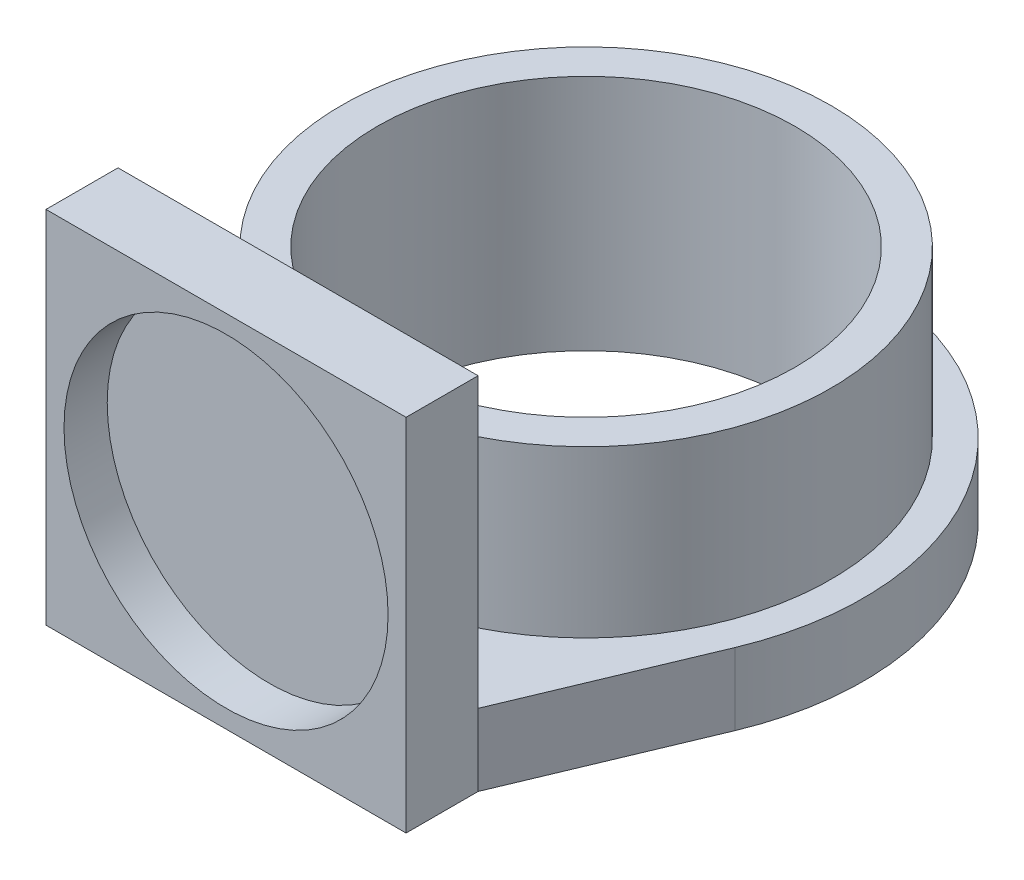
ISO-10303-21;
HEADER;
FILE_DESCRIPTION(('STEP AP214'),'2;1');
FILE_NAME('part.step','',(''),(''),'','','');
FILE_SCHEMA(('AUTOMOTIVE_DESIGN { 1 0 10303 214 1 1 1 1 }'));
ENDSEC;
DATA;
#1=APPLICATION_CONTEXT('core data for automotive mechanical design processes');
#2=APPLICATION_PROTOCOL_DEFINITION('international standard','automotive_design',2000,#1);
#3=PRODUCT_CONTEXT('',#1,'mechanical');
#4=PRODUCT('Part','Part','',(#3));
#5=PRODUCT_RELATED_PRODUCT_CATEGORY('part','',(#4));
#6=PRODUCT_DEFINITION_FORMATION('','',#4);
#7=PRODUCT_DEFINITION_CONTEXT('part definition',#1,'design');
#8=PRODUCT_DEFINITION('design','',#6,#7);
#9=PRODUCT_DEFINITION_SHAPE('','',#8);
#10=(LENGTH_UNIT() NAMED_UNIT(*) SI_UNIT(.MILLI.,.METRE.));
#11=(NAMED_UNIT(*) PLANE_ANGLE_UNIT() SI_UNIT($,.RADIAN.));
#12=(NAMED_UNIT(*) SI_UNIT($,.STERADIAN.) SOLID_ANGLE_UNIT());
#13=UNCERTAINTY_MEASURE_WITH_UNIT(LENGTH_MEASURE(1.E-05),#10,'distance_accuracy_value','');
#14=(GEOMETRIC_REPRESENTATION_CONTEXT(3) GLOBAL_UNCERTAINTY_ASSIGNED_CONTEXT((#13)) GLOBAL_UNIT_ASSIGNED_CONTEXT((#10,
#11,#12)) REPRESENTATION_CONTEXT('',''));
#15=CARTESIAN_POINT('',(0.,0.,0.));
#16=DIRECTION('',(0.,0.,1.));
#17=DIRECTION('',(1.,0.,0.));
#18=AXIS2_PLACEMENT_3D('',#15,#16,#17);
#19=CARTESIAN_POINT('',(0.,-15.,-40.));
#20=DIRECTION('',(0.,-1.,0.));
#21=DIRECTION('',(0.,0.,-1.));
#22=AXIS2_PLACEMENT_3D('',#19,#20,#21);
#23=PLANE('',#22);
#24=DIRECTION('',(-1.,0.,0.));
#25=VECTOR('',#24,1.);
#26=CARTESIAN_POINT('',(-25.,-15.,0.));
#27=LINE('',#26,#25);
#28=CARTESIAN_POINT('',(25.,-15.,0.));
#29=VERTEX_POINT('',#28);
#30=CARTESIAN_POINT('',(-25.,-15.,0.));
#31=VERTEX_POINT('',#30);
#32=EDGE_CURVE('E125',#29,#31,#27,.T.);
#33=ORIENTED_EDGE('',*,*,#32,.F.);
#34=DIRECTION('',(-0.385916402810975,0.,0.922533755502441));
#35=VECTOR('',#34,1.);
#36=CARTESIAN_POINT('',(25.,-15.,0.));
#37=LINE('',#36,#35);
#38=CARTESIAN_POINT('',(35.517549586844,-15.,-25.1422184917774));
#39=VERTEX_POINT('',#38);
#40=EDGE_CURVE('E120',#39,#29,#37,.T.);
#41=ORIENTED_EDGE('',*,*,#40,.F.);
#42=CARTESIAN_POINT('',(0.,-15.,-40.));
#43=DIRECTION('',(0.,-1.,0.));
#44=DIRECTION('',(0.,0.,-1.));
#45=AXIS2_PLACEMENT_3D('',#42,#43,#44);
#46=CIRCLE('',#45,38.5);
#47=CARTESIAN_POINT('',(-35.517549586844,-15.,-25.1422184917774));
#48=VERTEX_POINT('',#47);
#49=EDGE_CURVE('E109',#48,#39,#46,.T.);
#50=ORIENTED_EDGE('',*,*,#49,.F.);
#51=DIRECTION('',(-0.385916402810975,0.,-0.922533755502441));
#52=VECTOR('',#51,1.);
#53=CARTESIAN_POINT('',(-25.,-15.,0.));
#54=LINE('',#53,#52);
#55=EDGE_CURVE('E54',#31,#48,#54,.T.);
#56=ORIENTED_EDGE('',*,*,#55,.F.);
#57=EDGE_LOOP('',(#33,#41,#50,#56));
#58=FACE_BOUND('',#57,.T.);
#59=CARTESIAN_POINT('',(0.,-15.,-40.));
#60=DIRECTION('',(0.,-1.,0.));
#61=DIRECTION('',(0.,0.,-1.));
#62=AXIS2_PLACEMENT_3D('',#59,#60,#61);
#63=CIRCLE('',#62,34.);
#64=CARTESIAN_POINT('',(0.,-15.,-74.));
#65=VERTEX_POINT('',#64);
#66=EDGE_CURVE('E11',#65,#65,#63,.F.);
#67=ORIENTED_EDGE('',*,*,#66,.F.);
#68=EDGE_LOOP('',(#67));
#69=FACE_BOUND('',#68,.T.);
#70=ADVANCED_FACE('F39',(#58,#69),#23,.F.);
#71=CARTESIAN_POINT('',(0.,0.,0.));
#72=DIRECTION('',(0.,0.,-1.));
#73=DIRECTION('',(-1.,0.,0.));
#74=AXIS2_PLACEMENT_3D('',#71,#72,#73);
#75=PLANE('',#74);
#76=DIRECTION('',(0.,1.,0.));
#77=VECTOR('',#76,1.);
#78=CARTESIAN_POINT('',(25.,-25.,0.));
#79=LINE('',#78,#77);
#80=CARTESIAN_POINT('',(25.,25.,0.));
#81=VERTEX_POINT('',#80);
#82=EDGE_CURVE('E138',#29,#81,#79,.T.);
#83=ORIENTED_EDGE('',*,*,#82,.F.);
#84=ORIENTED_EDGE('',*,*,#32,.T.);
#85=DIRECTION('',(0.,-1.,0.));
#86=VECTOR('',#85,1.);
#87=CARTESIAN_POINT('',(-25.,-25.,0.));
#88=LINE('',#87,#86);
#89=CARTESIAN_POINT('',(-25.,25.,0.));
#90=VERTEX_POINT('',#89);
#91=EDGE_CURVE('E143',#90,#31,#88,.T.);
#92=ORIENTED_EDGE('',*,*,#91,.F.);
#93=DIRECTION('',(-1.,0.,0.));
#94=VECTOR('',#93,1.);
#95=CARTESIAN_POINT('',(-25.,25.,0.));
#96=LINE('',#95,#94);
#97=EDGE_CURVE('E79',#81,#90,#96,.T.);
#98=ORIENTED_EDGE('',*,*,#97,.F.);
#99=EDGE_LOOP('',(#83,#84,#92,#98));
#100=FACE_BOUND('',#99,.T.);
#101=ADVANCED_FACE('F168',(#100),#75,.T.);
#102=CARTESIAN_POINT('',(25.,-25.,10.));
#103=DIRECTION('',(-1.,0.,0.));
#104=DIRECTION('',(0.,0.,1.));
#105=AXIS2_PLACEMENT_3D('',#102,#103,#104);
#106=PLANE('',#105);
#107=CARTESIAN_POINT('',(25.,-25.,0.));
#108=VERTEX_POINT('',#107);
#109=EDGE_CURVE('E149',#108,#29,#79,.T.);
#110=ORIENTED_EDGE('',*,*,#109,.T.);
#111=ORIENTED_EDGE('',*,*,#82,.T.);
#112=DIRECTION('',(0.,0.,-1.));
#113=VECTOR('',#112,1.);
#114=CARTESIAN_POINT('',(25.,25.,10.));
#115=LINE('',#114,#113);
#116=CARTESIAN_POINT('',(25.,25.,10.));
#117=VERTEX_POINT('',#116);
#118=EDGE_CURVE('E47',#117,#81,#115,.T.);
#119=ORIENTED_EDGE('',*,*,#118,.F.);
#120=DIRECTION('',(0.,1.,0.));
#121=VECTOR('',#120,1.);
#122=CARTESIAN_POINT('',(25.,-25.,10.));
#123=LINE('',#122,#121);
#124=CARTESIAN_POINT('',(25.,-25.,10.));
#125=VERTEX_POINT('',#124);
#126=EDGE_CURVE('E141',#125,#117,#123,.T.);
#127=ORIENTED_EDGE('',*,*,#126,.F.);
#128=DIRECTION('',(0.,0.,-1.));
#129=VECTOR('',#128,1.);
#130=CARTESIAN_POINT('',(25.,-25.,10.));
#131=LINE('',#130,#129);
#132=EDGE_CURVE('E148',#125,#108,#131,.T.);
#133=ORIENTED_EDGE('',*,*,#132,.T.);
#134=EDGE_LOOP('',(#110,#111,#119,#127,#133));
#135=FACE_BOUND('',#134,.T.);
#136=ADVANCED_FACE('F41',(#135),#106,.F.);
#137=CARTESIAN_POINT('',(-25.,25.,10.));
#138=DIRECTION('',(0.,-1.,0.));
#139=DIRECTION('',(0.,0.,-1.));
#140=AXIS2_PLACEMENT_3D('',#137,#138,#139);
#141=PLANE('',#140);
#142=ORIENTED_EDGE('',*,*,#97,.T.);
#143=DIRECTION('',(0.,0.,-1.));
#144=VECTOR('',#143,1.);
#145=CARTESIAN_POINT('',(-25.,25.,10.));
#146=LINE('',#145,#144);
#147=CARTESIAN_POINT('',(-25.,25.,10.));
#148=VERTEX_POINT('',#147);
#149=EDGE_CURVE('E160',#148,#90,#146,.T.);
#150=ORIENTED_EDGE('',*,*,#149,.F.);
#151=DIRECTION('',(-1.,0.,0.));
#152=VECTOR('',#151,1.);
#153=CARTESIAN_POINT('',(-25.,25.,10.));
#154=LINE('',#153,#152);
#155=EDGE_CURVE('E84',#117,#148,#154,.T.);
#156=ORIENTED_EDGE('',*,*,#155,.F.);
#157=ORIENTED_EDGE('',*,*,#118,.T.);
#158=EDGE_LOOP('',(#142,#150,#156,#157));
#159=FACE_BOUND('',#158,.T.);
#160=ADVANCED_FACE('F162',(#159),#141,.F.);
#161=CARTESIAN_POINT('',(-25.,-25.,10.));
#162=DIRECTION('',(1.,0.,0.));
#163=DIRECTION('',(0.,0.,-1.));
#164=AXIS2_PLACEMENT_3D('',#161,#162,#163);
#165=PLANE('',#164);
#166=ORIENTED_EDGE('',*,*,#91,.T.);
#167=DIRECTION('',(0.,-1.,0.));
#168=VECTOR('',#167,1.);
#169=CARTESIAN_POINT('',(-25.,-15.,0.));
#170=LINE('',#169,#168);
#171=CARTESIAN_POINT('',(-25.,-25.,0.));
#172=VERTEX_POINT('',#171);
#173=EDGE_CURVE('E116',#31,#172,#170,.T.);
#174=ORIENTED_EDGE('',*,*,#173,.T.);
#175=DIRECTION('',(0.,0.,-1.));
#176=VECTOR('',#175,1.);
#177=CARTESIAN_POINT('',(-25.,-25.,10.));
#178=LINE('',#177,#176);
#179=CARTESIAN_POINT('',(-25.,-25.,10.));
#180=VERTEX_POINT('',#179);
#181=EDGE_CURVE('E157',#180,#172,#178,.T.);
#182=ORIENTED_EDGE('',*,*,#181,.F.);
#183=DIRECTION('',(0.,-1.,0.));
#184=VECTOR('',#183,1.);
#185=CARTESIAN_POINT('',(-25.,-25.,10.));
#186=LINE('',#185,#184);
#187=EDGE_CURVE('E145',#148,#180,#186,.T.);
#188=ORIENTED_EDGE('',*,*,#187,.F.);
#189=ORIENTED_EDGE('',*,*,#149,.T.);
#190=EDGE_LOOP('',(#166,#174,#182,#188,#189));
#191=FACE_BOUND('',#190,.T.);
#192=ADVANCED_FACE('F170',(#191),#165,.F.);
#193=CARTESIAN_POINT('',(-25.,-25.,10.));
#194=DIRECTION('',(0.,1.,0.));
#195=DIRECTION('',(0.,0.,1.));
#196=AXIS2_PLACEMENT_3D('',#193,#194,#195);
#197=PLANE('',#196);
#198=ORIENTED_EDGE('',*,*,#181,.T.);
#199=DIRECTION('',(-0.385916402810975,0.,-0.922533755502441));
#200=VECTOR('',#199,1.);
#201=CARTESIAN_POINT('',(-25.,-25.,0.));
#202=LINE('',#201,#200);
#203=CARTESIAN_POINT('',(-35.517549586844,-25.,-25.1422184917774));
#204=VERTEX_POINT('',#203);
#205=EDGE_CURVE('E132',#172,#204,#202,.T.);
#206=ORIENTED_EDGE('',*,*,#205,.T.);
#207=CARTESIAN_POINT('',(0.,-25.,-40.));
#208=DIRECTION('',(0.,-1.,0.));
#209=DIRECTION('',(0.,0.,-1.));
#210=AXIS2_PLACEMENT_3D('',#207,#208,#209);
#211=CIRCLE('',#210,38.5);
#212=CARTESIAN_POINT('',(35.517549586844,-25.,-25.1422184917774));
#213=VERTEX_POINT('',#212);
#214=EDGE_CURVE('E112',#204,#213,#211,.T.);
#215=ORIENTED_EDGE('',*,*,#214,.T.);
#216=DIRECTION('',(-0.385916402810975,0.,0.922533755502441));
#217=VECTOR('',#216,1.);
#218=CARTESIAN_POINT('',(25.,-25.,0.));
#219=LINE('',#218,#217);
#220=EDGE_CURVE('E127',#213,#108,#219,.T.);
#221=ORIENTED_EDGE('',*,*,#220,.T.);
#222=ORIENTED_EDGE('',*,*,#132,.F.);
#223=DIRECTION('',(1.,0.,0.));
#224=VECTOR('',#223,1.);
#225=CARTESIAN_POINT('',(-25.,-25.,10.));
#226=LINE('',#225,#224);
#227=EDGE_CURVE('E63',#180,#125,#226,.T.);
#228=ORIENTED_EDGE('',*,*,#227,.F.);
#229=EDGE_LOOP('',(#198,#206,#215,#221,#222,#228));
#230=FACE_BOUND('',#229,.T.);
#231=CARTESIAN_POINT('',(0.,-25.,-40.));
#232=DIRECTION('',(0.,-1.,0.));
#233=DIRECTION('',(0.,0.,-1.));
#234=AXIS2_PLACEMENT_3D('',#231,#232,#233);
#235=CIRCLE('',#234,29.);
#236=CARTESIAN_POINT('',(0.,-25.,-69.));
#237=VERTEX_POINT('',#236);
#238=EDGE_CURVE('E134',#237,#237,#235,.T.);
#239=ORIENTED_EDGE('',*,*,#238,.F.);
#240=EDGE_LOOP('',(#239));
#241=FACE_BOUND('',#240,.T.);
#242=ADVANCED_FACE('F176',(#230,#241),#197,.F.);
#243=CARTESIAN_POINT('',(0.,0.,10.));
#244=DIRECTION('',(0.,0.,-1.));
#245=DIRECTION('',(-1.,0.,0.));
#246=AXIS2_PLACEMENT_3D('',#243,#244,#245);
#247=PLANE('',#246);
#248=CARTESIAN_POINT('',(0.,0.,10.));
#249=DIRECTION('',(0.,0.,1.));
#250=DIRECTION('',(1.,0.,0.));
#251=AXIS2_PLACEMENT_3D('',#248,#249,#250);
#252=CIRCLE('',#251,22.5);
#253=CARTESIAN_POINT('',(22.5,0.,10.));
#254=VERTEX_POINT('',#253);
#255=EDGE_CURVE('E224',#254,#254,#252,.T.);
#256=ORIENTED_EDGE('',*,*,#255,.F.);
#257=EDGE_LOOP('',(#256));
#258=FACE_BOUND('',#257,.T.);
#259=ORIENTED_EDGE('',*,*,#126,.T.);
#260=ORIENTED_EDGE('',*,*,#155,.T.);
#261=ORIENTED_EDGE('',*,*,#187,.T.);
#262=ORIENTED_EDGE('',*,*,#227,.T.);
#263=EDGE_LOOP('',(#259,#260,#261,#262));
#264=FACE_BOUND('',#263,.T.);
#265=ADVANCED_FACE('F173',(#258,#264),#247,.F.);
#266=CARTESIAN_POINT('',(25.,-15.,0.));
#267=DIRECTION('',(0.922533755502441,0.,0.385916402810975));
#268=DIRECTION('',(0.385916402810975,0.,-0.922533755502441));
#269=AXIS2_PLACEMENT_3D('',#266,#267,#268);
#270=PLANE('',#269);
#271=ORIENTED_EDGE('',*,*,#220,.F.);
#272=DIRECTION('',(0.,-1.,0.));
#273=VECTOR('',#272,1.);
#274=CARTESIAN_POINT('',(35.517549586844,-15.,-25.1422184917774));
#275=LINE('',#274,#273);
#276=EDGE_CURVE('E115',#39,#213,#275,.T.);
#277=ORIENTED_EDGE('',*,*,#276,.F.);
#278=ORIENTED_EDGE('',*,*,#40,.T.);
#279=ORIENTED_EDGE('',*,*,#109,.F.);
#280=EDGE_LOOP('',(#271,#277,#278,#279));
#281=FACE_BOUND('',#280,.T.);
#282=ADVANCED_FACE('F175',(#281),#270,.T.);
#283=CARTESIAN_POINT('',(0.,-15.,-40.));
#284=DIRECTION('',(0.,-1.,0.));
#285=DIRECTION('',(0.,0.,-1.));
#286=AXIS2_PLACEMENT_3D('',#283,#284,#285);
#287=CYLINDRICAL_SURFACE('',#286,38.5);
#288=ORIENTED_EDGE('',*,*,#214,.F.);
#289=DIRECTION('',(0.,-1.,0.));
#290=VECTOR('',#289,1.);
#291=CARTESIAN_POINT('',(-35.517549586844,-15.,-25.1422184917774));
#292=LINE('',#291,#290);
#293=EDGE_CURVE('E107',#48,#204,#292,.T.);
#294=ORIENTED_EDGE('',*,*,#293,.F.);
#295=ORIENTED_EDGE('',*,*,#49,.T.);
#296=ORIENTED_EDGE('',*,*,#276,.T.);
#297=EDGE_LOOP('',(#288,#294,#295,#296));
#298=FACE_BOUND('',#297,.T.);
#299=ADVANCED_FACE('F108',(#298),#287,.T.);
#300=CARTESIAN_POINT('',(-25.,-15.,0.));
#301=DIRECTION('',(-0.922533755502441,0.,0.385916402810975));
#302=DIRECTION('',(0.385916402810975,0.,0.922533755502441));
#303=AXIS2_PLACEMENT_3D('',#300,#301,#302);
#304=PLANE('',#303);
#305=ORIENTED_EDGE('',*,*,#205,.F.);
#306=ORIENTED_EDGE('',*,*,#173,.F.);
#307=ORIENTED_EDGE('',*,*,#55,.T.);
#308=ORIENTED_EDGE('',*,*,#293,.T.);
#309=EDGE_LOOP('',(#305,#306,#307,#308));
#310=FACE_BOUND('',#309,.T.);
#311=ADVANCED_FACE('F122',(#310),#304,.T.);
#312=CARTESIAN_POINT('',(0.,-15.,-40.));
#313=DIRECTION('',(0.,-1.,0.));
#314=DIRECTION('',(0.,0.,-1.));
#315=AXIS2_PLACEMENT_3D('',#312,#313,#314);
#316=CYLINDRICAL_SURFACE('',#315,29.);
#317=ORIENTED_EDGE('',*,*,#238,.T.);
#318=EDGE_LOOP('',(#317));
#319=FACE_BOUND('',#318,.T.);
#320=CARTESIAN_POINT('',(0.,8.,-40.));
#321=DIRECTION('',(0.,1.,0.));
#322=DIRECTION('',(0.,0.,1.));
#323=AXIS2_PLACEMENT_3D('',#320,#321,#322);
#324=CIRCLE('',#323,29.);
#325=CARTESIAN_POINT('',(0.,8.,-11.));
#326=VERTEX_POINT('',#325);
#327=EDGE_CURVE('E219',#326,#326,#324,.T.);
#328=ORIENTED_EDGE('',*,*,#327,.T.);
#329=EDGE_LOOP('',(#328));
#330=FACE_BOUND('',#329,.T.);
#331=ADVANCED_FACE('F198',(#319,#330),#316,.F.);
#332=CARTESIAN_POINT('',(0.,0.,4.));
#333=DIRECTION('',(0.,0.,1.));
#334=DIRECTION('',(1.,0.,0.));
#335=AXIS2_PLACEMENT_3D('',#332,#333,#334);
#336=CYLINDRICAL_SURFACE('',#335,22.5);
#337=CARTESIAN_POINT('',(0.,0.,4.));
#338=DIRECTION('',(0.,0.,1.));
#339=DIRECTION('',(1.,0.,0.));
#340=AXIS2_PLACEMENT_3D('',#337,#338,#339);
#341=CIRCLE('',#340,22.5);
#342=CARTESIAN_POINT('',(22.5,0.,4.));
#343=VERTEX_POINT('',#342);
#344=EDGE_CURVE('E227',#343,#343,#341,.T.);
#345=ORIENTED_EDGE('',*,*,#344,.F.);
#346=EDGE_LOOP('',(#345));
#347=FACE_BOUND('',#346,.T.);
#348=ORIENTED_EDGE('',*,*,#255,.T.);
#349=EDGE_LOOP('',(#348));
#350=FACE_BOUND('',#349,.T.);
#351=ADVANCED_FACE('F207',(#347,#350),#336,.F.);
#352=CARTESIAN_POINT('',(0.,0.,4.));
#353=DIRECTION('',(0.,0.,1.));
#354=DIRECTION('',(1.,0.,0.));
#355=AXIS2_PLACEMENT_3D('',#352,#353,#354);
#356=PLANE('',#355);
#357=ORIENTED_EDGE('',*,*,#344,.T.);
#358=EDGE_LOOP('',(#357));
#359=FACE_BOUND('',#358,.T.);
#360=ADVANCED_FACE('F212',(#359),#356,.T.);
#361=CARTESIAN_POINT('',(0.,8.,-40.));
#362=DIRECTION('',(0.,1.,0.));
#363=DIRECTION('',(0.,0.,1.));
#364=AXIS2_PLACEMENT_3D('',#361,#362,#363);
#365=PLANE('',#364);
#366=CARTESIAN_POINT('',(0.,8.,-40.));
#367=DIRECTION('',(0.,1.,0.));
#368=DIRECTION('',(0.,0.,1.));
#369=AXIS2_PLACEMENT_3D('',#366,#367,#368);
#370=CIRCLE('',#369,34.);
#371=CARTESIAN_POINT('',(0.,8.,-6.));
#372=VERTEX_POINT('',#371);
#373=EDGE_CURVE('E221',#372,#372,#370,.T.);
#374=ORIENTED_EDGE('',*,*,#373,.T.);
#375=EDGE_LOOP('',(#374));
#376=FACE_BOUND('',#375,.T.);
#377=ORIENTED_EDGE('',*,*,#327,.F.);
#378=EDGE_LOOP('',(#377));
#379=FACE_BOUND('',#378,.T.);
#380=ADVANCED_FACE('F235',(#376,#379),#365,.T.);
#381=CARTESIAN_POINT('',(0.,8.,-40.));
#382=DIRECTION('',(0.,-1.,0.));
#383=DIRECTION('',(0.,0.,-1.));
#384=AXIS2_PLACEMENT_3D('',#381,#382,#383);
#385=CYLINDRICAL_SURFACE('',#384,34.);
#386=ORIENTED_EDGE('',*,*,#373,.F.);
#387=EDGE_LOOP('',(#386));
#388=FACE_BOUND('',#387,.T.);
#389=ORIENTED_EDGE('',*,*,#66,.T.);
#390=EDGE_LOOP('',(#389));
#391=FACE_BOUND('',#390,.T.);
#392=ADVANCED_FACE('F238',(#388,#391),#385,.T.);
#393=CLOSED_SHELL('',(#70,#101,#136,#160,#192,#242,#265,#282,#299,#311,#331,#351,#360,#380,#392));
#394=MANIFOLD_SOLID_BREP('B2',#393);
#395=ADVANCED_BREP_SHAPE_REPRESENTATION('',(#18,#394),#14);
#396=SHAPE_DEFINITION_REPRESENTATION(#9,#395);
ENDSEC;
END-ISO-10303-21;
